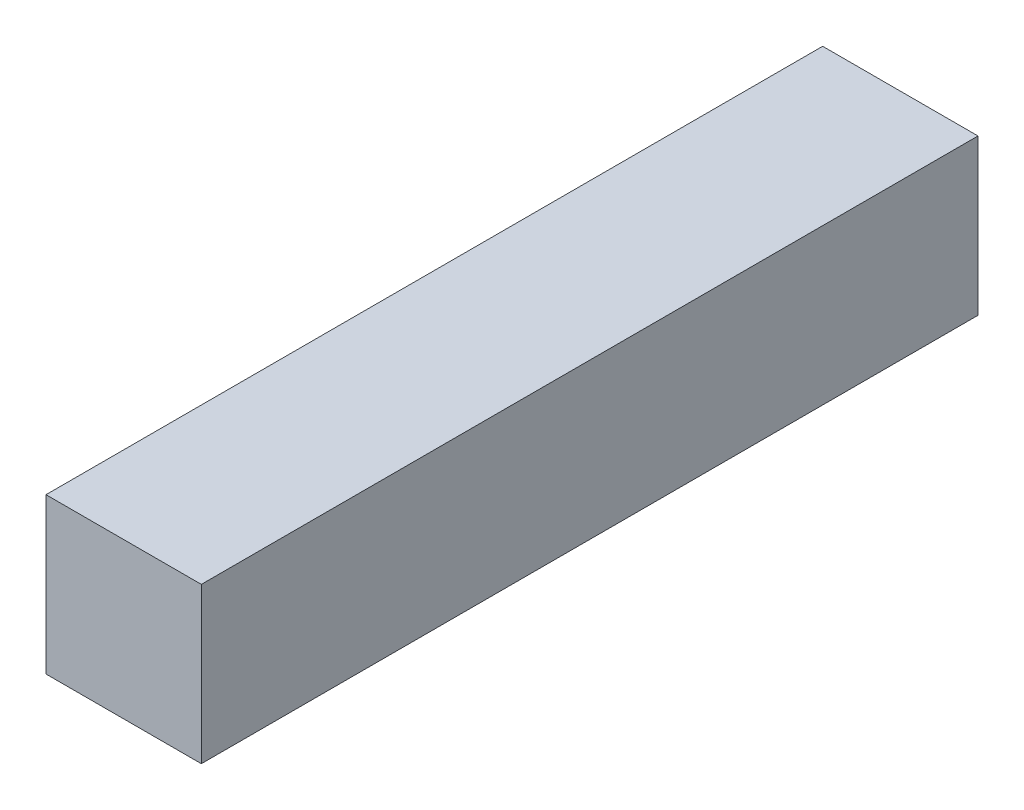
ISO-10303-21;
HEADER;
FILE_DESCRIPTION(('STEP AP214'),'2;1');
FILE_NAME('part.step','',(''),(''),'','','');
FILE_SCHEMA(('AUTOMOTIVE_DESIGN { 1 0 10303 214 1 1 1 1 }'));
ENDSEC;
DATA;
#1=APPLICATION_CONTEXT('core data for automotive mechanical design processes');
#2=APPLICATION_PROTOCOL_DEFINITION('international standard','automotive_design',2000,#1);
#3=PRODUCT_CONTEXT('',#1,'mechanical');
#4=PRODUCT('Part','Part','',(#3));
#5=PRODUCT_RELATED_PRODUCT_CATEGORY('part','',(#4));
#6=PRODUCT_DEFINITION_FORMATION('','',#4);
#7=PRODUCT_DEFINITION_CONTEXT('part definition',#1,'design');
#8=PRODUCT_DEFINITION('design','',#6,#7);
#9=PRODUCT_DEFINITION_SHAPE('','',#8);
#10=(LENGTH_UNIT() NAMED_UNIT(*) SI_UNIT(.MILLI.,.METRE.));
#11=(NAMED_UNIT(*) PLANE_ANGLE_UNIT() SI_UNIT($,.RADIAN.));
#12=(NAMED_UNIT(*) SI_UNIT($,.STERADIAN.) SOLID_ANGLE_UNIT());
#13=UNCERTAINTY_MEASURE_WITH_UNIT(LENGTH_MEASURE(1.E-05),#10,'distance_accuracy_value','');
#14=(GEOMETRIC_REPRESENTATION_CONTEXT(3) GLOBAL_UNCERTAINTY_ASSIGNED_CONTEXT((#13)) GLOBAL_UNIT_ASSIGNED_CONTEXT((#10,
#11,#12)) REPRESENTATION_CONTEXT('',''));
#15=CARTESIAN_POINT('',(0.,0.,0.));
#16=DIRECTION('',(0.,0.,1.));
#17=DIRECTION('',(1.,0.,0.));
#18=AXIS2_PLACEMENT_3D('',#15,#16,#17);
#19=CARTESIAN_POINT('',(0.3999992,-0.3999992,0.));
#20=DIRECTION('',(-1.,0.,0.));
#21=DIRECTION('',(0.,0.,1.));
#22=AXIS2_PLACEMENT_3D('',#19,#20,#21);
#23=PLANE('',#22);
#24=DIRECTION('',(0.,0.,-1.));
#25=VECTOR('',#24,1.);
#26=CARTESIAN_POINT('',(0.3999992,0.40000174,0.));
#27=LINE('',#26,#25);
#28=CARTESIAN_POINT('',(0.3999992,0.40000174,0.));
#29=VERTEX_POINT('',#28);
#30=CARTESIAN_POINT('',(0.3999992,0.40000174,4.00000216));
#31=VERTEX_POINT('',#30);
#32=EDGE_CURVE('E58',#29,#31,#27,.F.);
#33=ORIENTED_EDGE('',*,*,#32,.T.);
#34=DIRECTION('',(0.,1.,0.));
#35=VECTOR('',#34,1.);
#36=CARTESIAN_POINT('',(0.3999992,0.40000174,4.00000216));
#37=LINE('',#36,#35);
#38=CARTESIAN_POINT('',(0.3999992,-0.3999992,4.00000216));
#39=VERTEX_POINT('',#38);
#40=EDGE_CURVE('E55',#31,#39,#37,.F.);
#41=ORIENTED_EDGE('',*,*,#40,.T.);
#42=DIRECTION('',(0.,0.,1.));
#43=VECTOR('',#42,1.);
#44=CARTESIAN_POINT('',(0.3999992,-0.3999992,0.));
#45=LINE('',#44,#43);
#46=CARTESIAN_POINT('',(0.3999992,-0.3999992,0.));
#47=VERTEX_POINT('',#46);
#48=EDGE_CURVE('E77',#39,#47,#45,.F.);
#49=ORIENTED_EDGE('',*,*,#48,.T.);
#50=DIRECTION('',(0.,1.,0.));
#51=VECTOR('',#50,1.);
#52=CARTESIAN_POINT('',(0.3999992,-0.3999992,0.));
#53=LINE('',#52,#51);
#54=EDGE_CURVE('E20',#29,#47,#53,.F.);
#55=ORIENTED_EDGE('',*,*,#54,.F.);
#56=EDGE_LOOP('',(#33,#41,#49,#55));
#57=FACE_BOUND('',#56,.T.);
#58=ADVANCED_FACE('F17',(#57),#23,.F.);
#59=CARTESIAN_POINT('',(0.3999992,0.40000174,0.));
#60=DIRECTION('',(0.,-1.,0.));
#61=DIRECTION('',(0.,0.,-1.));
#62=AXIS2_PLACEMENT_3D('',#59,#60,#61);
#63=PLANE('',#62);
#64=DIRECTION('',(0.,0.,-1.));
#65=VECTOR('',#64,1.);
#66=CARTESIAN_POINT('',(-0.3999992,0.40000174,0.));
#67=LINE('',#66,#65);
#68=CARTESIAN_POINT('',(-0.3999992,0.40000174,0.));
#69=VERTEX_POINT('',#68);
#70=CARTESIAN_POINT('',(-0.3999992,0.40000174,4.00000216));
#71=VERTEX_POINT('',#70);
#72=EDGE_CURVE('E73',#69,#71,#67,.F.);
#73=ORIENTED_EDGE('',*,*,#72,.T.);
#74=DIRECTION('',(-1.,0.,0.));
#75=VECTOR('',#74,1.);
#76=CARTESIAN_POINT('',(-0.3999992,0.40000174,4.00000216));
#77=LINE('',#76,#75);
#78=EDGE_CURVE('E63',#71,#31,#77,.F.);
#79=ORIENTED_EDGE('',*,*,#78,.T.);
#80=ORIENTED_EDGE('',*,*,#32,.F.);
#81=DIRECTION('',(-1.,0.,0.));
#82=VECTOR('',#81,1.);
#83=CARTESIAN_POINT('',(-0.3999992,0.40000174,0.));
#84=LINE('',#83,#82);
#85=EDGE_CURVE('E79',#69,#29,#84,.F.);
#86=ORIENTED_EDGE('',*,*,#85,.F.);
#87=EDGE_LOOP('',(#73,#79,#80,#86));
#88=FACE_BOUND('',#87,.T.);
#89=ADVANCED_FACE('F72',(#88),#63,.F.);
#90=CARTESIAN_POINT('',(-0.3999992,0.40000174,4.00000216));
#91=DIRECTION('',(0.,0.,-1.));
#92=DIRECTION('',(-1.,0.,0.));
#93=AXIS2_PLACEMENT_3D('',#90,#91,#92);
#94=PLANE('',#93);
#95=DIRECTION('',(1.,0.,0.));
#96=VECTOR('',#95,1.);
#97=CARTESIAN_POINT('',(-0.3999992,-0.3999992,4.00000216));
#98=LINE('',#97,#96);
#99=CARTESIAN_POINT('',(-0.3999992,-0.3999992,4.00000216));
#100=VERTEX_POINT('',#99);
#101=EDGE_CURVE('E69',#100,#39,#98,.T.);
#102=ORIENTED_EDGE('',*,*,#101,.T.);
#103=ORIENTED_EDGE('',*,*,#40,.F.);
#104=ORIENTED_EDGE('',*,*,#78,.F.);
#105=DIRECTION('',(0.,1.,0.));
#106=VECTOR('',#105,1.);
#107=CARTESIAN_POINT('',(-0.3999992,0.40000174,4.00000216));
#108=LINE('',#107,#106);
#109=EDGE_CURVE('E83',#71,#100,#108,.F.);
#110=ORIENTED_EDGE('',*,*,#109,.T.);
#111=EDGE_LOOP('',(#102,#103,#104,#110));
#112=FACE_BOUND('',#111,.T.);
#113=ADVANCED_FACE('F66',(#112),#94,.F.);
#114=CARTESIAN_POINT('',(-0.3999992,-0.3999992,0.));
#115=DIRECTION('',(0.,1.,0.));
#116=DIRECTION('',(0.,0.,1.));
#117=AXIS2_PLACEMENT_3D('',#114,#115,#116);
#118=PLANE('',#117);
#119=ORIENTED_EDGE('',*,*,#48,.F.);
#120=ORIENTED_EDGE('',*,*,#101,.F.);
#121=DIRECTION('',(0.,0.,-1.));
#122=VECTOR('',#121,1.);
#123=CARTESIAN_POINT('',(-0.3999992,-0.3999992,0.));
#124=LINE('',#123,#122);
#125=CARTESIAN_POINT('',(-0.3999992,-0.3999992,0.));
#126=VERTEX_POINT('',#125);
#127=EDGE_CURVE('E26',#100,#126,#124,.T.);
#128=ORIENTED_EDGE('',*,*,#127,.T.);
#129=DIRECTION('',(-1.,0.,0.));
#130=VECTOR('',#129,1.);
#131=CARTESIAN_POINT('',(-0.3999992,-0.3999992,0.));
#132=LINE('',#131,#130);
#133=EDGE_CURVE('E34',#47,#126,#132,.T.);
#134=ORIENTED_EDGE('',*,*,#133,.F.);
#135=EDGE_LOOP('',(#119,#120,#128,#134));
#136=FACE_BOUND('',#135,.T.);
#137=ADVANCED_FACE('F88',(#136),#118,.F.);
#138=CARTESIAN_POINT('',(-0.3999992,0.40000174,0.));
#139=DIRECTION('',(0.,0.,-1.));
#140=DIRECTION('',(-1.,0.,0.));
#141=AXIS2_PLACEMENT_3D('',#138,#139,#140);
#142=PLANE('',#141);
#143=ORIENTED_EDGE('',*,*,#133,.T.);
#144=DIRECTION('',(0.,1.,0.));
#145=VECTOR('',#144,1.);
#146=CARTESIAN_POINT('',(-0.3999992,0.40000174,0.));
#147=LINE('',#146,#145);
#148=EDGE_CURVE('E11',#126,#69,#147,.T.);
#149=ORIENTED_EDGE('',*,*,#148,.T.);
#150=ORIENTED_EDGE('',*,*,#85,.T.);
#151=ORIENTED_EDGE('',*,*,#54,.T.);
#152=EDGE_LOOP('',(#143,#149,#150,#151));
#153=FACE_BOUND('',#152,.T.);
#154=ADVANCED_FACE('F91',(#153),#142,.T.);
#155=CARTESIAN_POINT('',(-0.3999992,0.40000174,0.));
#156=DIRECTION('',(1.,0.,0.));
#157=DIRECTION('',(0.,0.,-1.));
#158=AXIS2_PLACEMENT_3D('',#155,#156,#157);
#159=PLANE('',#158);
#160=ORIENTED_EDGE('',*,*,#127,.F.);
#161=ORIENTED_EDGE('',*,*,#109,.F.);
#162=ORIENTED_EDGE('',*,*,#72,.F.);
#163=ORIENTED_EDGE('',*,*,#148,.F.);
#164=EDGE_LOOP('',(#160,#161,#162,#163));
#165=FACE_BOUND('',#164,.T.);
#166=ADVANCED_FACE('F90',(#165),#159,.F.);
#167=CLOSED_SHELL('',(#58,#89,#113,#137,#154,#166));
#168=MANIFOLD_SOLID_BREP('B1',#167);
#169=ADVANCED_BREP_SHAPE_REPRESENTATION('',(#18,#168),#14);
#170=SHAPE_DEFINITION_REPRESENTATION(#9,#169);
ENDSEC;
END-ISO-10303-21;
